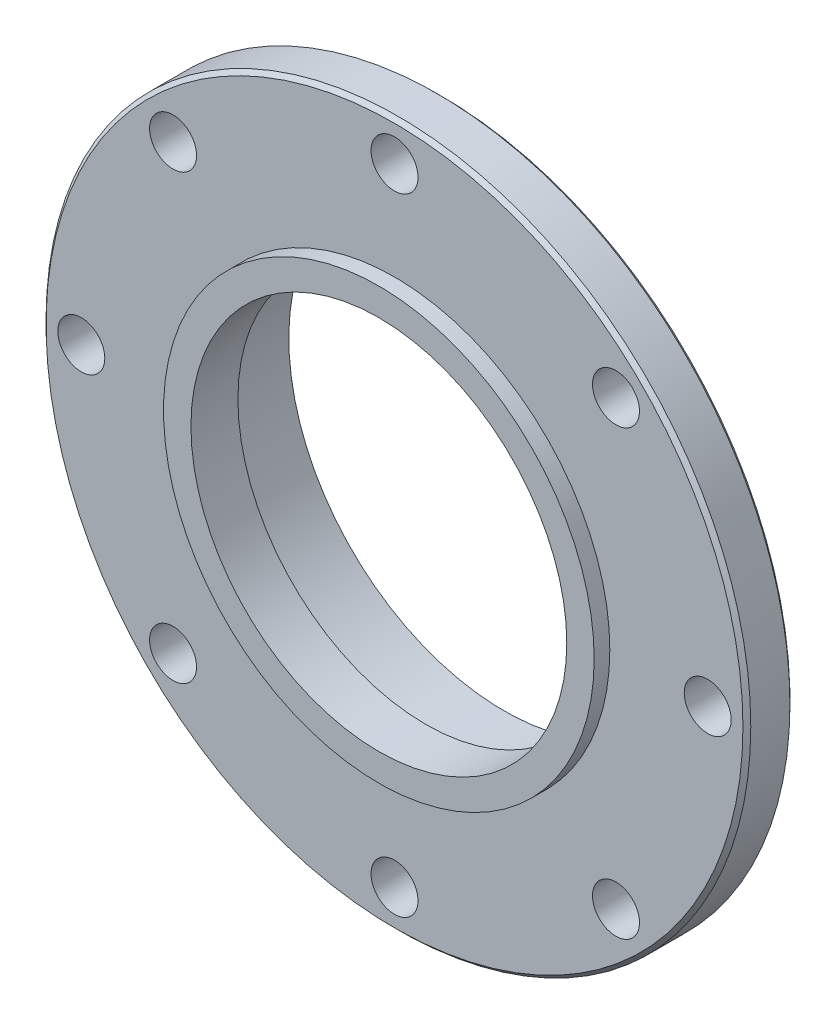
ISO-10303-21;
HEADER;
FILE_DESCRIPTION(('STEP AP214'),'2;1');
FILE_NAME('part.step','',(''),(''),'','','');
FILE_SCHEMA(('AUTOMOTIVE_DESIGN { 1 0 10303 214 1 1 1 1 }'));
ENDSEC;
DATA;
#1=APPLICATION_CONTEXT('core data for automotive mechanical design processes');
#2=APPLICATION_PROTOCOL_DEFINITION('international standard','automotive_design',2000,#1);
#3=PRODUCT_CONTEXT('',#1,'mechanical');
#4=PRODUCT('Part','Part','',(#3));
#5=PRODUCT_RELATED_PRODUCT_CATEGORY('part','',(#4));
#6=PRODUCT_DEFINITION_FORMATION('','',#4);
#7=PRODUCT_DEFINITION_CONTEXT('part definition',#1,'design');
#8=PRODUCT_DEFINITION('design','',#6,#7);
#9=PRODUCT_DEFINITION_SHAPE('','',#8);
#10=(LENGTH_UNIT() NAMED_UNIT(*) SI_UNIT(.MILLI.,.METRE.));
#11=(NAMED_UNIT(*) PLANE_ANGLE_UNIT() SI_UNIT($,.RADIAN.));
#12=(NAMED_UNIT(*) SI_UNIT($,.STERADIAN.) SOLID_ANGLE_UNIT());
#13=UNCERTAINTY_MEASURE_WITH_UNIT(LENGTH_MEASURE(1.E-05),#10,'distance_accuracy_value','');
#14=(GEOMETRIC_REPRESENTATION_CONTEXT(3) GLOBAL_UNCERTAINTY_ASSIGNED_CONTEXT((#13)) GLOBAL_UNIT_ASSIGNED_CONTEXT((#10,
#11,#12)) REPRESENTATION_CONTEXT('',''));
#15=CARTESIAN_POINT('',(0.,0.,0.));
#16=DIRECTION('',(0.,0.,1.));
#17=DIRECTION('',(1.,0.,0.));
#18=AXIS2_PLACEMENT_3D('',#15,#16,#17);
#19=CARTESIAN_POINT('',(0.,0.,0.));
#20=DIRECTION('',(0.,0.,1.));
#21=DIRECTION('',(1.,0.,0.));
#22=AXIS2_PLACEMENT_3D('',#19,#20,#21);
#23=CYLINDRICAL_SURFACE('',#22,24.);
#24=CARTESIAN_POINT('',(0.,0.,16.));
#25=DIRECTION('',(0.,0.,1.));
#26=DIRECTION('',(1.,0.,0.));
#27=AXIS2_PLACEMENT_3D('',#24,#25,#26);
#28=CIRCLE('',#27,24.);
#29=CARTESIAN_POINT('',(24.,0.,16.));
#30=VERTEX_POINT('',#29);
#31=EDGE_CURVE('E72',#30,#30,#28,.T.);
#32=ORIENTED_EDGE('',*,*,#31,.T.);
#33=EDGE_LOOP('',(#32));
#34=FACE_BOUND('',#33,.T.);
#35=CARTESIAN_POINT('',(0.,0.,10.));
#36=DIRECTION('',(0.,0.,-1.));
#37=DIRECTION('',(0.,1.,0.));
#38=AXIS2_PLACEMENT_3D('',#35,#36,#37);
#39=CIRCLE('',#38,24.);
#40=CARTESIAN_POINT('',(0.,24.,10.));
#41=VERTEX_POINT('',#40);
#42=EDGE_CURVE('E46',#41,#41,#39,.F.);
#43=ORIENTED_EDGE('',*,*,#42,.F.);
#44=EDGE_LOOP('',(#43));
#45=FACE_BOUND('',#44,.T.);
#46=ADVANCED_FACE('F28',(#34,#45),#23,.F.);
#47=CARTESIAN_POINT('',(0.,0.,14.));
#48=DIRECTION('',(0.,0.,-1.));
#49=DIRECTION('',(-1.,0.,0.));
#50=AXIS2_PLACEMENT_3D('',#47,#48,#49);
#51=CYLINDRICAL_SURFACE('',#50,45.);
#52=CARTESIAN_POINT('',(0.,0.,8.50000000000002));
#53=DIRECTION('',(0.,0.,-1.));
#54=DIRECTION('',(-1.,0.,0.));
#55=AXIS2_PLACEMENT_3D('',#52,#53,#54);
#56=CIRCLE('',#55,45.);
#57=CARTESIAN_POINT('',(-45.,0.,8.50000000000002));
#58=VERTEX_POINT('',#57);
#59=EDGE_CURVE('E53',#58,#58,#56,.F.);
#60=ORIENTED_EDGE('',*,*,#59,.T.);
#61=EDGE_LOOP('',(#60));
#62=FACE_BOUND('',#61,.T.);
#63=CARTESIAN_POINT('',(0.,0.,13.5));
#64=DIRECTION('',(0.,0.,1.));
#65=DIRECTION('',(1.,0.,0.));
#66=AXIS2_PLACEMENT_3D('',#63,#64,#65);
#67=CIRCLE('',#66,45.);
#68=CARTESIAN_POINT('',(45.,0.,13.5));
#69=VERTEX_POINT('',#68);
#70=EDGE_CURVE('E59',#69,#69,#67,.F.);
#71=ORIENTED_EDGE('',*,*,#70,.T.);
#72=EDGE_LOOP('',(#71));
#73=FACE_BOUND('',#72,.T.);
#74=ADVANCED_FACE('F140',(#62,#73),#51,.T.);
#75=CARTESIAN_POINT('',(0.,0.,0.));
#76=DIRECTION('',(0.,0.,1.));
#77=DIRECTION('',(1.,0.,0.));
#78=AXIS2_PLACEMENT_3D('',#75,#76,#77);
#79=PLANE('',#78);
#80=CARTESIAN_POINT('',(0.,0.,0.));
#81=DIRECTION('',(0.,0.,-1.));
#82=DIRECTION('',(0.,1.,0.));
#83=AXIS2_PLACEMENT_3D('',#80,#81,#82);
#84=CIRCLE('',#83,27.5);
#85=CARTESIAN_POINT('',(0.,27.5,0.));
#86=VERTEX_POINT('',#85);
#87=EDGE_CURVE('E121',#86,#86,#84,.T.);
#88=ORIENTED_EDGE('',*,*,#87,.F.);
#89=EDGE_LOOP('',(#88));
#90=FACE_BOUND('',#89,.T.);
#91=CARTESIAN_POINT('',(0.,0.,0.));
#92=DIRECTION('',(0.,0.,1.));
#93=DIRECTION('',(1.,0.,0.));
#94=AXIS2_PLACEMENT_3D('',#91,#92,#93);
#95=CIRCLE('',#94,29.5);
#96=CARTESIAN_POINT('',(29.5,0.,0.));
#97=VERTEX_POINT('',#96);
#98=EDGE_CURVE('E43',#97,#97,#95,.F.);
#99=ORIENTED_EDGE('',*,*,#98,.T.);
#100=EDGE_LOOP('',(#99));
#101=FACE_BOUND('',#100,.T.);
#102=ADVANCED_FACE('F136',(#90,#101),#79,.F.);
#103=CARTESIAN_POINT('',(-5.80449725646712E-13,40.,15.));
#104=DIRECTION('',(0.,0.,-1.));
#105=DIRECTION('',(0.,1.,0.));
#106=AXIS2_PLACEMENT_3D('',#103,#104,#105);
#107=CYLINDRICAL_SURFACE('',#106,3.00000000000087);
#108=CARTESIAN_POINT('',(-5.80310947768634E-13,40.,14.));
#109=DIRECTION('',(0.,0.,1.));
#110=DIRECTION('',(1.,0.,0.));
#111=AXIS2_PLACEMENT_3D('',#108,#109,#110);
#112=CIRCLE('',#111,3.00000000000087);
#113=CARTESIAN_POINT('',(3.00000000000029,40.,14.));
#114=VERTEX_POINT('',#113);
#115=EDGE_CURVE('E77',#114,#114,#112,.T.);
#116=ORIENTED_EDGE('',*,*,#115,.T.);
#117=EDGE_LOOP('',(#116));
#118=FACE_BOUND('',#117,.T.);
#119=CARTESIAN_POINT('',(-5.79478280500165E-13,40.,8.));
#120=DIRECTION('',(0.,0.,-1.));
#121=DIRECTION('',(-1.,0.,0.));
#122=AXIS2_PLACEMENT_3D('',#119,#120,#121);
#123=CIRCLE('',#122,3.00000000000087);
#124=CARTESIAN_POINT('',(-3.00000000000145,40.,8.));
#125=VERTEX_POINT('',#124);
#126=EDGE_CURVE('E101',#125,#125,#123,.F.);
#127=ORIENTED_EDGE('',*,*,#126,.F.);
#128=EDGE_LOOP('',(#127));
#129=FACE_BOUND('',#128,.T.);
#130=ADVANCED_FACE('F139',(#118,#129),#107,.F.);
#131=CARTESIAN_POINT('',(-28.2842712474624,28.2842712474618,15.));
#132=DIRECTION('',(0.,0.,-1.));
#133=DIRECTION('',(0.,1.,0.));
#134=AXIS2_PLACEMENT_3D('',#131,#132,#133);
#135=CYLINDRICAL_SURFACE('',#134,3.00000000000087);
#136=CARTESIAN_POINT('',(-28.2842712474624,28.2842712474618,14.));
#137=DIRECTION('',(0.,0.,1.));
#138=DIRECTION('',(1.,0.,0.));
#139=AXIS2_PLACEMENT_3D('',#136,#137,#138);
#140=CIRCLE('',#139,3.00000000000087);
#141=CARTESIAN_POINT('',(-25.2842712474616,28.2842712474618,14.));
#142=VERTEX_POINT('',#141);
#143=EDGE_CURVE('E80',#142,#142,#140,.T.);
#144=ORIENTED_EDGE('',*,*,#143,.T.);
#145=EDGE_LOOP('',(#144));
#146=FACE_BOUND('',#145,.T.);
#147=CARTESIAN_POINT('',(-28.2842712474624,28.2842712474618,8.));
#148=DIRECTION('',(0.,0.,-1.));
#149=DIRECTION('',(-1.,0.,0.));
#150=AXIS2_PLACEMENT_3D('',#147,#148,#149);
#151=CIRCLE('',#150,3.00000000000087);
#152=CARTESIAN_POINT('',(-31.2842712474633,28.2842712474618,8.));
#153=VERTEX_POINT('',#152);
#154=EDGE_CURVE('E104',#153,#153,#151,.F.);
#155=ORIENTED_EDGE('',*,*,#154,.F.);
#156=EDGE_LOOP('',(#155));
#157=FACE_BOUND('',#156,.T.);
#158=ADVANCED_FACE('F215',(#146,#157),#135,.F.);
#159=CARTESIAN_POINT('',(-40.0000000000004,-1.4616454747929E-13,15.));
#160=DIRECTION('',(0.,0.,-1.));
#161=DIRECTION('',(0.,1.,0.));
#162=AXIS2_PLACEMENT_3D('',#159,#160,#161);
#163=CYLINDRICAL_SURFACE('',#162,3.00000000000087);
#164=CARTESIAN_POINT('',(-40.0000000000004,-1.45730866610296E-13,14.));
#165=DIRECTION('',(0.,0.,1.));
#166=DIRECTION('',(1.,0.,0.));
#167=AXIS2_PLACEMENT_3D('',#164,#165,#166);
#168=CIRCLE('',#167,3.00000000000087);
#169=CARTESIAN_POINT('',(-36.9999999999996,-1.45730866610296E-13,14.));
#170=VERTEX_POINT('',#169);
#171=EDGE_CURVE('E83',#170,#170,#168,.T.);
#172=ORIENTED_EDGE('',*,*,#171,.T.);
#173=EDGE_LOOP('',(#172));
#174=FACE_BOUND('',#173,.T.);
#175=CARTESIAN_POINT('',(-40.0000000000004,-1.43128781396331E-13,8.));
#176=DIRECTION('',(0.,0.,-1.));
#177=DIRECTION('',(-1.,0.,0.));
#178=AXIS2_PLACEMENT_3D('',#175,#176,#177);
#179=CIRCLE('',#178,3.00000000000087);
#180=CARTESIAN_POINT('',(-43.0000000000013,-1.43128781396331E-13,8.));
#181=VERTEX_POINT('',#180);
#182=EDGE_CURVE('E107',#181,#181,#179,.F.);
#183=ORIENTED_EDGE('',*,*,#182,.F.);
#184=EDGE_LOOP('',(#183));
#185=FACE_BOUND('',#184,.T.);
#186=ADVANCED_FACE('F234',(#174,#185),#163,.F.);
#187=CARTESIAN_POINT('',(-28.2842712474622,-28.284271247462,15.));
#188=DIRECTION('',(0.,0.,-1.));
#189=DIRECTION('',(0.,1.,0.));
#190=AXIS2_PLACEMENT_3D('',#187,#188,#189);
#191=CYLINDRICAL_SURFACE('',#190,3.00000000000079);
#192=CARTESIAN_POINT('',(-28.2842712474622,-28.284271247462,14.));
#193=DIRECTION('',(0.,0.,1.));
#194=DIRECTION('',(1.,0.,0.));
#195=AXIS2_PLACEMENT_3D('',#192,#193,#194);
#196=CIRCLE('',#195,3.00000000000079);
#197=CARTESIAN_POINT('',(-25.2842712474615,-28.284271247462,14.));
#198=VERTEX_POINT('',#197);
#199=EDGE_CURVE('E86',#198,#198,#196,.T.);
#200=ORIENTED_EDGE('',*,*,#199,.T.);
#201=EDGE_LOOP('',(#200));
#202=FACE_BOUND('',#201,.T.);
#203=CARTESIAN_POINT('',(-28.2842712474622,-28.284271247462,8.));
#204=DIRECTION('',(0.,0.,-1.));
#205=DIRECTION('',(-1.,0.,0.));
#206=AXIS2_PLACEMENT_3D('',#203,#204,#205);
#207=CIRCLE('',#206,3.00000000000079);
#208=CARTESIAN_POINT('',(-31.284271247463,-28.284271247462,8.));
#209=VERTEX_POINT('',#208);
#210=EDGE_CURVE('E110',#209,#209,#207,.F.);
#211=ORIENTED_EDGE('',*,*,#210,.F.);
#212=EDGE_LOOP('',(#211));
#213=FACE_BOUND('',#212,.T.);
#214=ADVANCED_FACE('F239',(#202,#213),#191,.F.);
#215=CARTESIAN_POINT('',(-3.0138703951441E-13,-40.,15.));
#216=DIRECTION('',(0.,0.,-1.));
#217=DIRECTION('',(0.,1.,0.));
#218=AXIS2_PLACEMENT_3D('',#215,#216,#217);
#219=CYLINDRICAL_SURFACE('',#218,3.00000000000087);
#220=CARTESIAN_POINT('',(-3.01248261636332E-13,-40.,14.));
#221=DIRECTION('',(0.,0.,1.));
#222=DIRECTION('',(1.,0.,0.));
#223=AXIS2_PLACEMENT_3D('',#220,#221,#222);
#224=CIRCLE('',#223,3.00000000000087);
#225=CARTESIAN_POINT('',(3.00000000000057,-40.,14.));
#226=VERTEX_POINT('',#225);
#227=EDGE_CURVE('E89',#226,#226,#224,.T.);
#228=ORIENTED_EDGE('',*,*,#227,.T.);
#229=EDGE_LOOP('',(#228));
#230=FACE_BOUND('',#229,.T.);
#231=CARTESIAN_POINT('',(-3.00415594367863E-13,-40.,8.));
#232=DIRECTION('',(0.,0.,-1.));
#233=DIRECTION('',(-1.,0.,0.));
#234=AXIS2_PLACEMENT_3D('',#231,#232,#233);
#235=CIRCLE('',#234,3.00000000000087);
#236=CARTESIAN_POINT('',(-3.00000000000117,-40.,8.));
#237=VERTEX_POINT('',#236);
#238=EDGE_CURVE('E113',#237,#237,#235,.F.);
#239=ORIENTED_EDGE('',*,*,#238,.F.);
#240=EDGE_LOOP('',(#239));
#241=FACE_BOUND('',#240,.T.);
#242=ADVANCED_FACE('F245',(#230,#241),#219,.F.);
#243=CARTESIAN_POINT('',(28.2842712474616,-28.2842712474618,15.));
#244=DIRECTION('',(0.,0.,-1.));
#245=DIRECTION('',(0.,1.,0.));
#246=AXIS2_PLACEMENT_3D('',#243,#244,#245);
#247=CYLINDRICAL_SURFACE('',#246,3.00000000000087);
#248=CARTESIAN_POINT('',(28.2842712474616,-28.2842712474618,14.));
#249=DIRECTION('',(0.,0.,1.));
#250=DIRECTION('',(1.,0.,0.));
#251=AXIS2_PLACEMENT_3D('',#248,#249,#250);
#252=CIRCLE('',#251,3.00000000000087);
#253=CARTESIAN_POINT('',(31.2842712474624,-28.2842712474618,14.));
#254=VERTEX_POINT('',#253);
#255=EDGE_CURVE('E92',#254,#254,#252,.T.);
#256=ORIENTED_EDGE('',*,*,#255,.T.);
#257=EDGE_LOOP('',(#256));
#258=FACE_BOUND('',#257,.T.);
#259=CARTESIAN_POINT('',(28.2842712474616,-28.2842712474618,8.));
#260=DIRECTION('',(0.,0.,-1.));
#261=DIRECTION('',(-1.,0.,0.));
#262=AXIS2_PLACEMENT_3D('',#259,#260,#261);
#263=CIRCLE('',#262,3.00000000000087);
#264=CARTESIAN_POINT('',(25.2842712474607,-28.2842712474618,8.));
#265=VERTEX_POINT('',#264);
#266=EDGE_CURVE('E116',#265,#265,#263,.F.);
#267=ORIENTED_EDGE('',*,*,#266,.F.);
#268=EDGE_LOOP('',(#267));
#269=FACE_BOUND('',#268,.T.);
#270=ADVANCED_FACE('F249',(#258,#269),#247,.F.);
#271=CARTESIAN_POINT('',(39.9999999999996,1.2083679846943E-13,15.));
#272=DIRECTION('',(0.,0.,-1.));
#273=DIRECTION('',(0.,1.,0.));
#274=AXIS2_PLACEMENT_3D('',#271,#272,#273);
#275=CYLINDRICAL_SURFACE('',#274,3.00000000000087);
#276=CARTESIAN_POINT('',(39.9999999999996,1.21270479338424E-13,14.));
#277=DIRECTION('',(0.,0.,1.));
#278=DIRECTION('',(1.,0.,0.));
#279=AXIS2_PLACEMENT_3D('',#276,#277,#278);
#280=CIRCLE('',#279,3.00000000000087);
#281=CARTESIAN_POINT('',(43.0000000000004,1.21270479338424E-13,14.));
#282=VERTEX_POINT('',#281);
#283=EDGE_CURVE('E95',#282,#282,#280,.T.);
#284=ORIENTED_EDGE('',*,*,#283,.T.);
#285=EDGE_LOOP('',(#284));
#286=FACE_BOUND('',#285,.T.);
#287=CARTESIAN_POINT('',(39.9999999999996,1.2387256455239E-13,8.));
#288=DIRECTION('',(0.,0.,-1.));
#289=DIRECTION('',(-1.,0.,0.));
#290=AXIS2_PLACEMENT_3D('',#287,#288,#289);
#291=CIRCLE('',#290,3.00000000000087);
#292=CARTESIAN_POINT('',(36.9999999999987,1.2387256455239E-13,8.));
#293=VERTEX_POINT('',#292);
#294=EDGE_CURVE('E62',#293,#293,#291,.F.);
#295=ORIENTED_EDGE('',*,*,#294,.F.);
#296=EDGE_LOOP('',(#295));
#297=FACE_BOUND('',#296,.T.);
#298=ADVANCED_FACE('F253',(#286,#297),#275,.F.);
#299=CARTESIAN_POINT('',(28.2842712474614,28.284271247462,15.));
#300=DIRECTION('',(0.,0.,-1.));
#301=DIRECTION('',(0.,1.,0.));
#302=AXIS2_PLACEMENT_3D('',#299,#300,#301);
#303=CYLINDRICAL_SURFACE('',#302,3.00000000000087);
#304=CARTESIAN_POINT('',(28.2842712474614,28.284271247462,14.));
#305=DIRECTION('',(0.,0.,1.));
#306=DIRECTION('',(1.,0.,0.));
#307=AXIS2_PLACEMENT_3D('',#304,#305,#306);
#308=CIRCLE('',#307,3.00000000000087);
#309=CARTESIAN_POINT('',(31.2842712474622,28.284271247462,14.));
#310=VERTEX_POINT('',#309);
#311=EDGE_CURVE('E98',#310,#310,#308,.T.);
#312=ORIENTED_EDGE('',*,*,#311,.T.);
#313=EDGE_LOOP('',(#312));
#314=FACE_BOUND('',#313,.T.);
#315=CARTESIAN_POINT('',(28.2842712474614,28.284271247462,8.));
#316=DIRECTION('',(0.,0.,-1.));
#317=DIRECTION('',(-1.,0.,0.));
#318=AXIS2_PLACEMENT_3D('',#315,#316,#317);
#319=CIRCLE('',#318,3.00000000000087);
#320=CARTESIAN_POINT('',(25.2842712474605,28.284271247462,8.));
#321=VERTEX_POINT('',#320);
#322=EDGE_CURVE('E48',#321,#321,#319,.F.);
#323=ORIENTED_EDGE('',*,*,#322,.F.);
#324=EDGE_LOOP('',(#323));
#325=FACE_BOUND('',#324,.T.);
#326=ADVANCED_FACE('F180',(#314,#325),#303,.F.);
#327=CARTESIAN_POINT('',(0.,0.,14.));
#328=DIRECTION('',(0.,0.,1.));
#329=DIRECTION('',(1.,0.,0.));
#330=AXIS2_PLACEMENT_3D('',#327,#328,#329);
#331=PLANE('',#330);
#332=CARTESIAN_POINT('',(0.,0.,14.));
#333=DIRECTION('',(0.,0.,1.));
#334=DIRECTION('',(1.,0.,0.));
#335=AXIS2_PLACEMENT_3D('',#332,#333,#334);
#336=CIRCLE('',#335,44.5);
#337=CARTESIAN_POINT('',(44.5,0.,14.));
#338=VERTEX_POINT('',#337);
#339=EDGE_CURVE('E65',#338,#338,#336,.T.);
#340=ORIENTED_EDGE('',*,*,#339,.T.);
#341=EDGE_LOOP('',(#340));
#342=FACE_BOUND('',#341,.T.);
#343=ORIENTED_EDGE('',*,*,#311,.F.);
#344=EDGE_LOOP('',(#343));
#345=FACE_BOUND('',#344,.T.);
#346=ORIENTED_EDGE('',*,*,#283,.F.);
#347=EDGE_LOOP('',(#346));
#348=FACE_BOUND('',#347,.T.);
#349=ORIENTED_EDGE('',*,*,#255,.F.);
#350=EDGE_LOOP('',(#349));
#351=FACE_BOUND('',#350,.T.);
#352=ORIENTED_EDGE('',*,*,#227,.F.);
#353=EDGE_LOOP('',(#352));
#354=FACE_BOUND('',#353,.T.);
#355=ORIENTED_EDGE('',*,*,#199,.F.);
#356=EDGE_LOOP('',(#355));
#357=FACE_BOUND('',#356,.T.);
#358=ORIENTED_EDGE('',*,*,#171,.F.);
#359=EDGE_LOOP('',(#358));
#360=FACE_BOUND('',#359,.T.);
#361=ORIENTED_EDGE('',*,*,#143,.F.);
#362=EDGE_LOOP('',(#361));
#363=FACE_BOUND('',#362,.T.);
#364=ORIENTED_EDGE('',*,*,#115,.F.);
#365=EDGE_LOOP('',(#364));
#366=FACE_BOUND('',#365,.T.);
#367=CARTESIAN_POINT('',(0.,0.,14.));
#368=DIRECTION('',(0.,0.,1.));
#369=DIRECTION('',(1.,0.,0.));
#370=AXIS2_PLACEMENT_3D('',#367,#368,#369);
#371=CIRCLE('',#370,27.5);
#372=CARTESIAN_POINT('',(27.5,0.,14.));
#373=VERTEX_POINT('',#372);
#374=EDGE_CURVE('E69',#373,#373,#371,.T.);
#375=ORIENTED_EDGE('',*,*,#374,.F.);
#376=EDGE_LOOP('',(#375));
#377=FACE_BOUND('',#376,.T.);
#378=ADVANCED_FACE('F177',(#342,#345,#348,#351,#354,#357,#360,#363,#366,#377),#331,.T.);
#379=CARTESIAN_POINT('',(0.,0.,16.));
#380=DIRECTION('',(0.,0.,-1.));
#381=DIRECTION('',(-1.,0.,0.));
#382=AXIS2_PLACEMENT_3D('',#379,#380,#381);
#383=CYLINDRICAL_SURFACE('',#382,27.5);
#384=CARTESIAN_POINT('',(0.,0.,16.));
#385=DIRECTION('',(0.,0.,1.));
#386=DIRECTION('',(1.,0.,0.));
#387=AXIS2_PLACEMENT_3D('',#384,#385,#386);
#388=CIRCLE('',#387,27.5);
#389=CARTESIAN_POINT('',(27.5,0.,16.));
#390=VERTEX_POINT('',#389);
#391=EDGE_CURVE('E68',#390,#390,#388,.T.);
#392=ORIENTED_EDGE('',*,*,#391,.F.);
#393=EDGE_LOOP('',(#392));
#394=FACE_BOUND('',#393,.T.);
#395=ORIENTED_EDGE('',*,*,#374,.T.);
#396=EDGE_LOOP('',(#395));
#397=FACE_BOUND('',#396,.T.);
#398=ADVANCED_FACE('F173',(#394,#397),#383,.T.);
#399=CARTESIAN_POINT('',(0.,0.,16.));
#400=DIRECTION('',(0.,0.,1.));
#401=DIRECTION('',(1.,0.,0.));
#402=AXIS2_PLACEMENT_3D('',#399,#400,#401);
#403=PLANE('',#402);
#404=ORIENTED_EDGE('',*,*,#31,.F.);
#405=EDGE_LOOP('',(#404));
#406=FACE_BOUND('',#405,.T.);
#407=ORIENTED_EDGE('',*,*,#391,.T.);
#408=EDGE_LOOP('',(#407));
#409=FACE_BOUND('',#408,.T.);
#410=ADVANCED_FACE('F169',(#406,#409),#403,.T.);
#411=CARTESIAN_POINT('',(0.,0.,14.));
#412=DIRECTION('',(0.,0.,-1.));
#413=DIRECTION('',(-1.,0.,0.));
#414=AXIS2_PLACEMENT_3D('',#411,#412,#413);
#415=CONICAL_SURFACE('',#414,44.5,0.785398163397455);
#416=ORIENTED_EDGE('',*,*,#70,.F.);
#417=EDGE_LOOP('',(#416));
#418=FACE_BOUND('',#417,.T.);
#419=ORIENTED_EDGE('',*,*,#339,.F.);
#420=EDGE_LOOP('',(#419));
#421=FACE_BOUND('',#420,.T.);
#422=ADVANCED_FACE('F172',(#418,#421),#415,.T.);
#423=CARTESIAN_POINT('',(0.,0.,8.));
#424=DIRECTION('',(0.,0.,-1.));
#425=DIRECTION('',(-1.,0.,0.));
#426=AXIS2_PLACEMENT_3D('',#423,#424,#425);
#427=PLANE('',#426);
#428=CARTESIAN_POINT('',(0.,0.,8.));
#429=DIRECTION('',(0.,0.,-1.));
#430=DIRECTION('',(-1.,0.,0.));
#431=AXIS2_PLACEMENT_3D('',#428,#429,#430);
#432=CIRCLE('',#431,35.);
#433=CARTESIAN_POINT('',(-35.,0.,8.));
#434=VERTEX_POINT('',#433);
#435=EDGE_CURVE('E10',#434,#434,#432,.F.);
#436=ORIENTED_EDGE('',*,*,#435,.T.);
#437=EDGE_LOOP('',(#436));
#438=FACE_BOUND('',#437,.T.);
#439=CARTESIAN_POINT('',(0.,0.,8.));
#440=DIRECTION('',(0.,0.,-1.));
#441=DIRECTION('',(-1.,0.,0.));
#442=AXIS2_PLACEMENT_3D('',#439,#440,#441);
#443=CIRCLE('',#442,44.5);
#444=CARTESIAN_POINT('',(-44.5,0.,8.));
#445=VERTEX_POINT('',#444);
#446=EDGE_CURVE('E56',#445,#445,#443,.T.);
#447=ORIENTED_EDGE('',*,*,#446,.T.);
#448=EDGE_LOOP('',(#447));
#449=FACE_BOUND('',#448,.T.);
#450=ORIENTED_EDGE('',*,*,#126,.T.);
#451=EDGE_LOOP('',(#450));
#452=FACE_BOUND('',#451,.T.);
#453=ORIENTED_EDGE('',*,*,#182,.T.);
#454=EDGE_LOOP('',(#453));
#455=FACE_BOUND('',#454,.T.);
#456=ORIENTED_EDGE('',*,*,#238,.T.);
#457=EDGE_LOOP('',(#456));
#458=FACE_BOUND('',#457,.T.);
#459=ORIENTED_EDGE('',*,*,#294,.T.);
#460=EDGE_LOOP('',(#459));
#461=FACE_BOUND('',#460,.T.);
#462=ORIENTED_EDGE('',*,*,#322,.T.);
#463=EDGE_LOOP('',(#462));
#464=FACE_BOUND('',#463,.T.);
#465=ORIENTED_EDGE('',*,*,#266,.T.);
#466=EDGE_LOOP('',(#465));
#467=FACE_BOUND('',#466,.T.);
#468=ORIENTED_EDGE('',*,*,#210,.T.);
#469=EDGE_LOOP('',(#468));
#470=FACE_BOUND('',#469,.T.);
#471=ORIENTED_EDGE('',*,*,#154,.T.);
#472=EDGE_LOOP('',(#471));
#473=FACE_BOUND('',#472,.T.);
#474=ADVANCED_FACE('F184',(#438,#449,#452,#455,#458,#461,#464,#467,#470,#473),#427,.T.);
#475=CARTESIAN_POINT('',(0.,0.,8.));
#476=DIRECTION('',(0.,0.,-1.));
#477=DIRECTION('',(-1.,0.,0.));
#478=AXIS2_PLACEMENT_3D('',#475,#476,#477);
#479=CYLINDRICAL_SURFACE('',#478,30.);
#480=CARTESIAN_POINT('',(0.,0.,3.));
#481=DIRECTION('',(0.,0.,-1.));
#482=DIRECTION('',(-1.,0.,0.));
#483=AXIS2_PLACEMENT_3D('',#480,#481,#482);
#484=CIRCLE('',#483,30.);
#485=CARTESIAN_POINT('',(-30.,0.,3.));
#486=VERTEX_POINT('',#485);
#487=EDGE_CURVE('E35',#486,#486,#484,.T.);
#488=ORIENTED_EDGE('',*,*,#487,.T.);
#489=EDGE_LOOP('',(#488));
#490=FACE_BOUND('',#489,.T.);
#491=CARTESIAN_POINT('',(0.,0.,0.500000000000032));
#492=DIRECTION('',(0.,0.,1.));
#493=DIRECTION('',(1.,0.,0.));
#494=AXIS2_PLACEMENT_3D('',#491,#492,#493);
#495=CIRCLE('',#494,30.);
#496=CARTESIAN_POINT('',(30.,0.,0.500000000000032));
#497=VERTEX_POINT('',#496);
#498=EDGE_CURVE('E39',#497,#497,#495,.T.);
#499=ORIENTED_EDGE('',*,*,#498,.T.);
#500=EDGE_LOOP('',(#499));
#501=FACE_BOUND('',#500,.T.);
#502=ADVANCED_FACE('F153',(#490,#501),#479,.T.);
#503=CARTESIAN_POINT('',(0.,0.,8.));
#504=DIRECTION('',(0.,0.,1.));
#505=DIRECTION('',(1.,0.,0.));
#506=AXIS2_PLACEMENT_3D('',#503,#504,#505);
#507=CONICAL_SURFACE('',#506,44.5,0.785398163397455);
#508=ORIENTED_EDGE('',*,*,#59,.F.);
#509=EDGE_LOOP('',(#508));
#510=FACE_BOUND('',#509,.T.);
#511=ORIENTED_EDGE('',*,*,#446,.F.);
#512=EDGE_LOOP('',(#511));
#513=FACE_BOUND('',#512,.T.);
#514=ADVANCED_FACE('F146',(#510,#513),#507,.T.);
#515=CARTESIAN_POINT('',(0.,0.,0.));
#516=DIRECTION('',(0.,0.,1.));
#517=DIRECTION('',(1.,0.,0.));
#518=AXIS2_PLACEMENT_3D('',#515,#516,#517);
#519=CONICAL_SURFACE('',#518,29.5,0.785398163397445);
#520=ORIENTED_EDGE('',*,*,#498,.F.);
#521=EDGE_LOOP('',(#520));
#522=FACE_BOUND('',#521,.T.);
#523=ORIENTED_EDGE('',*,*,#98,.F.);
#524=EDGE_LOOP('',(#523));
#525=FACE_BOUND('',#524,.T.);
#526=ADVANCED_FACE('F144',(#522,#525),#519,.T.);
#527=CARTESIAN_POINT('',(0.,0.,10.));
#528=DIRECTION('',(0.,0.,-1.));
#529=DIRECTION('',(0.,1.,0.));
#530=AXIS2_PLACEMENT_3D('',#527,#528,#529);
#531=PLANE('',#530);
#532=CARTESIAN_POINT('',(0.,0.,10.));
#533=DIRECTION('',(0.,0.,-1.));
#534=DIRECTION('',(0.,1.,0.));
#535=AXIS2_PLACEMENT_3D('',#532,#533,#534);
#536=CIRCLE('',#535,27.5);
#537=CARTESIAN_POINT('',(0.,27.5,10.));
#538=VERTEX_POINT('',#537);
#539=EDGE_CURVE('E49',#538,#538,#536,.T.);
#540=ORIENTED_EDGE('',*,*,#539,.T.);
#541=EDGE_LOOP('',(#540));
#542=FACE_BOUND('',#541,.T.);
#543=ORIENTED_EDGE('',*,*,#42,.T.);
#544=EDGE_LOOP('',(#543));
#545=FACE_BOUND('',#544,.T.);
#546=ADVANCED_FACE('F127',(#542,#545),#531,.T.);
#547=CARTESIAN_POINT('',(0.,0.,10.));
#548=DIRECTION('',(0.,0.,-1.));
#549=DIRECTION('',(0.,1.,0.));
#550=AXIS2_PLACEMENT_3D('',#547,#548,#549);
#551=CYLINDRICAL_SURFACE('',#550,27.5);
#552=ORIENTED_EDGE('',*,*,#539,.F.);
#553=EDGE_LOOP('',(#552));
#554=FACE_BOUND('',#553,.T.);
#555=ORIENTED_EDGE('',*,*,#87,.T.);
#556=EDGE_LOOP('',(#555));
#557=FACE_BOUND('',#556,.T.);
#558=ADVANCED_FACE('F130',(#554,#557),#551,.F.);
#559=CARTESIAN_POINT('',(0.,0.,3.));
#560=DIRECTION('',(0.,0.,-1.));
#561=DIRECTION('',(-1.,0.,0.));
#562=AXIS2_PLACEMENT_3D('',#559,#560,#561);
#563=TOROIDAL_SURFACE('',#562,35.,5.);
#564=ORIENTED_EDGE('',*,*,#435,.F.);
#565=EDGE_LOOP('',(#564));
#566=FACE_BOUND('',#565,.T.);
#567=ORIENTED_EDGE('',*,*,#487,.F.);
#568=EDGE_LOOP('',(#567));
#569=FACE_BOUND('',#568,.T.);
#570=ADVANCED_FACE('F30',(#566,#569),#563,.F.);
#571=CLOSED_SHELL('',(#46,#74,#102,#130,#158,#186,#214,#242,#270,#298,#326,#378,#398,#410,#422,
#474,#502,#514,#526,#546,#558,#570));
#572=MANIFOLD_SOLID_BREP('B2',#571);
#573=ADVANCED_BREP_SHAPE_REPRESENTATION('',(#18,#572),#14);
#574=SHAPE_DEFINITION_REPRESENTATION(#9,#573);
ENDSEC;
END-ISO-10303-21;
